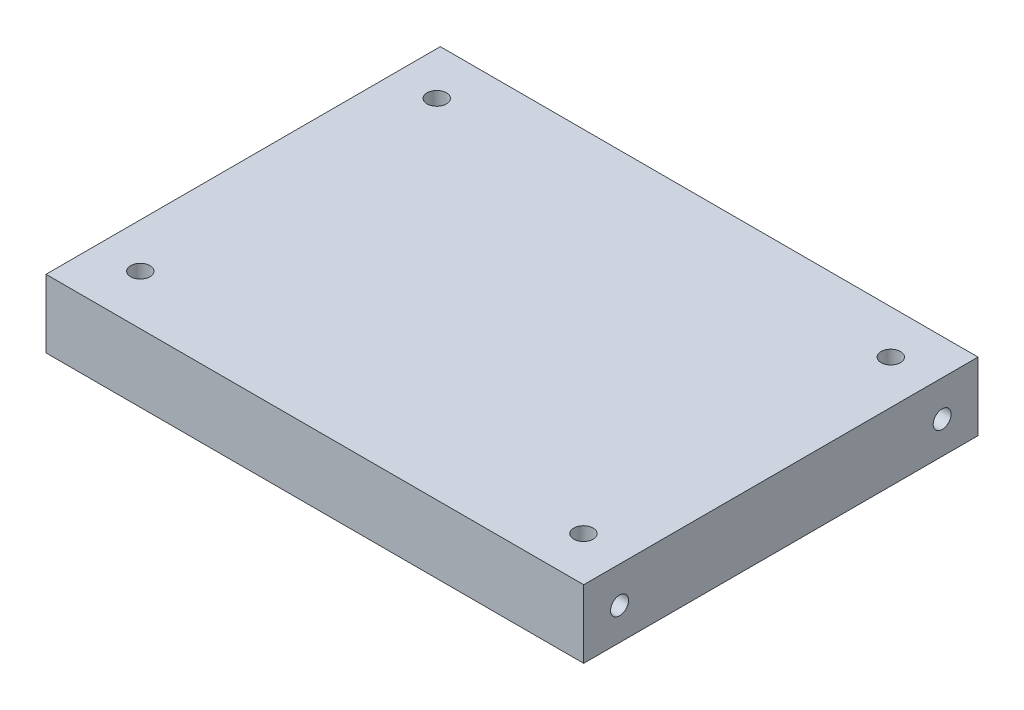
ISO-10303-21;
HEADER;
FILE_DESCRIPTION(('STEP AP214'),'2;1');
FILE_NAME('part.step','',(''),(''),'','','');
FILE_SCHEMA(('AUTOMOTIVE_DESIGN { 1 0 10303 214 1 1 1 1 }'));
ENDSEC;
DATA;
#1=APPLICATION_CONTEXT('core data for automotive mechanical design processes');
#2=APPLICATION_PROTOCOL_DEFINITION('international standard','automotive_design',2000,#1);
#3=PRODUCT_CONTEXT('',#1,'mechanical');
#4=PRODUCT('Part','Part','',(#3));
#5=PRODUCT_RELATED_PRODUCT_CATEGORY('part','',(#4));
#6=PRODUCT_DEFINITION_FORMATION('','',#4);
#7=PRODUCT_DEFINITION_CONTEXT('part definition',#1,'design');
#8=PRODUCT_DEFINITION('design','',#6,#7);
#9=PRODUCT_DEFINITION_SHAPE('','',#8);
#10=(LENGTH_UNIT() NAMED_UNIT(*) SI_UNIT(.MILLI.,.METRE.));
#11=(NAMED_UNIT(*) PLANE_ANGLE_UNIT() SI_UNIT($,.RADIAN.));
#12=(NAMED_UNIT(*) SI_UNIT($,.STERADIAN.) SOLID_ANGLE_UNIT());
#13=UNCERTAINTY_MEASURE_WITH_UNIT(LENGTH_MEASURE(1.E-05),#10,'distance_accuracy_value','');
#14=(GEOMETRIC_REPRESENTATION_CONTEXT(3) GLOBAL_UNCERTAINTY_ASSIGNED_CONTEXT((#13)) GLOBAL_UNIT_ASSIGNED_CONTEXT((#10,
#11,#12)) REPRESENTATION_CONTEXT('',''));
#15=CARTESIAN_POINT('',(0.,0.,0.));
#16=DIRECTION('',(0.,0.,1.));
#17=DIRECTION('',(1.,0.,0.));
#18=AXIS2_PLACEMENT_3D('',#15,#16,#17);
#19=CARTESIAN_POINT('',(-37.5,9.5,-27.5));
#20=DIRECTION('',(1.,0.,0.));
#21=DIRECTION('',(0.,0.,-1.));
#22=AXIS2_PLACEMENT_3D('',#19,#20,#21);
#23=PLANE('',#22);
#24=CARTESIAN_POINT('',(-37.5,4.50000000000001,22.5));
#25=DIRECTION('',(-1.,0.,0.));
#26=DIRECTION('',(0.,0.,1.));
#27=AXIS2_PLACEMENT_3D('',#24,#25,#26);
#28=CIRCLE('',#27,1.24999999999999);
#29=CARTESIAN_POINT('',(-37.5,4.50000000000001,23.75));
#30=VERTEX_POINT('',#29);
#31=EDGE_CURVE('E141',#30,#30,#28,.T.);
#32=ORIENTED_EDGE('',*,*,#31,.F.);
#33=EDGE_LOOP('',(#32));
#34=FACE_BOUND('',#33,.T.);
#35=CARTESIAN_POINT('',(-37.5,4.5,-22.5));
#36=DIRECTION('',(-1.,0.,0.));
#37=DIRECTION('',(0.,0.,1.));
#38=AXIS2_PLACEMENT_3D('',#35,#36,#37);
#39=CIRCLE('',#38,1.24999999999999);
#40=CARTESIAN_POINT('',(-37.5,4.5,-21.25));
#41=VERTEX_POINT('',#40);
#42=EDGE_CURVE('E149',#41,#41,#39,.T.);
#43=ORIENTED_EDGE('',*,*,#42,.F.);
#44=EDGE_LOOP('',(#43));
#45=FACE_BOUND('',#44,.T.);
#46=DIRECTION('',(0.,0.,1.));
#47=VECTOR('',#46,1.);
#48=CARTESIAN_POINT('',(-37.5,0.,-27.5));
#49=LINE('',#48,#47);
#50=CARTESIAN_POINT('',(-37.5,0.,-27.5));
#51=VERTEX_POINT('',#50);
#52=CARTESIAN_POINT('',(-37.5,0.,27.5));
#53=VERTEX_POINT('',#52);
#54=EDGE_CURVE('E185',#51,#53,#49,.T.);
#55=ORIENTED_EDGE('',*,*,#54,.T.);
#56=DIRECTION('',(0.,-1.,0.));
#57=VECTOR('',#56,1.);
#58=CARTESIAN_POINT('',(-37.5,9.5,27.5));
#59=LINE('',#58,#57);
#60=CARTESIAN_POINT('',(-37.5,9.5,27.5));
#61=VERTEX_POINT('',#60);
#62=EDGE_CURVE('E11',#61,#53,#59,.T.);
#63=ORIENTED_EDGE('',*,*,#62,.F.);
#64=DIRECTION('',(0.,0.,1.));
#65=VECTOR('',#64,1.);
#66=CARTESIAN_POINT('',(-37.5,9.5,-27.5));
#67=LINE('',#66,#65);
#68=CARTESIAN_POINT('',(-37.5,9.5,-27.5));
#69=VERTEX_POINT('',#68);
#70=EDGE_CURVE('E174',#69,#61,#67,.T.);
#71=ORIENTED_EDGE('',*,*,#70,.F.);
#72=DIRECTION('',(0.,-1.,0.));
#73=VECTOR('',#72,1.);
#74=CARTESIAN_POINT('',(-37.5,9.5,-27.5));
#75=LINE('',#74,#73);
#76=EDGE_CURVE('E184',#69,#51,#75,.T.);
#77=ORIENTED_EDGE('',*,*,#76,.T.);
#78=EDGE_LOOP('',(#55,#63,#71,#77));
#79=FACE_BOUND('',#78,.T.);
#80=ADVANCED_FACE('F53',(#34,#45,#79),#23,.F.);
#81=CARTESIAN_POINT('',(37.5,9.5,27.5));
#82=DIRECTION('',(0.,0.,-1.));
#83=DIRECTION('',(-1.,0.,0.));
#84=AXIS2_PLACEMENT_3D('',#81,#82,#83);
#85=PLANE('',#84);
#86=DIRECTION('',(1.,0.,0.));
#87=VECTOR('',#86,1.);
#88=CARTESIAN_POINT('',(37.5,0.,27.5));
#89=LINE('',#88,#87);
#90=CARTESIAN_POINT('',(37.5,0.,27.5));
#91=VERTEX_POINT('',#90);
#92=EDGE_CURVE('E189',#53,#91,#89,.T.);
#93=ORIENTED_EDGE('',*,*,#92,.T.);
#94=DIRECTION('',(0.,-1.,0.));
#95=VECTOR('',#94,1.);
#96=CARTESIAN_POINT('',(37.5,9.5,27.5));
#97=LINE('',#96,#95);
#98=CARTESIAN_POINT('',(37.5,9.5,27.5));
#99=VERTEX_POINT('',#98);
#100=EDGE_CURVE('E63',#99,#91,#97,.T.);
#101=ORIENTED_EDGE('',*,*,#100,.F.);
#102=DIRECTION('',(1.,0.,0.));
#103=VECTOR('',#102,1.);
#104=CARTESIAN_POINT('',(37.5,9.5,27.5));
#105=LINE('',#104,#103);
#106=EDGE_CURVE('E103',#61,#99,#105,.T.);
#107=ORIENTED_EDGE('',*,*,#106,.F.);
#108=ORIENTED_EDGE('',*,*,#62,.T.);
#109=EDGE_LOOP('',(#93,#101,#107,#108));
#110=FACE_BOUND('',#109,.T.);
#111=ADVANCED_FACE('F239',(#110),#85,.F.);
#112=CARTESIAN_POINT('',(37.5,9.5,-27.5));
#113=DIRECTION('',(-1.,0.,0.));
#114=DIRECTION('',(0.,0.,1.));
#115=AXIS2_PLACEMENT_3D('',#112,#113,#114);
#116=PLANE('',#115);
#117=CARTESIAN_POINT('',(37.5,4.50000000000001,22.5));
#118=DIRECTION('',(1.,0.,0.));
#119=DIRECTION('',(0.,0.,-1.));
#120=AXIS2_PLACEMENT_3D('',#117,#118,#119);
#121=CIRCLE('',#120,1.24999999999999);
#122=CARTESIAN_POINT('',(37.5,4.50000000000001,21.25));
#123=VERTEX_POINT('',#122);
#124=EDGE_CURVE('E128',#123,#123,#121,.T.);
#125=ORIENTED_EDGE('',*,*,#124,.F.);
#126=EDGE_LOOP('',(#125));
#127=FACE_BOUND('',#126,.T.);
#128=CARTESIAN_POINT('',(37.5,4.5,-22.5));
#129=DIRECTION('',(1.,0.,0.));
#130=DIRECTION('',(0.,0.,-1.));
#131=AXIS2_PLACEMENT_3D('',#128,#129,#130);
#132=CIRCLE('',#131,1.24999999999999);
#133=CARTESIAN_POINT('',(37.5,4.5,-23.75));
#134=VERTEX_POINT('',#133);
#135=EDGE_CURVE('E127',#134,#134,#132,.T.);
#136=ORIENTED_EDGE('',*,*,#135,.F.);
#137=EDGE_LOOP('',(#136));
#138=FACE_BOUND('',#137,.T.);
#139=DIRECTION('',(0.,0.,-1.));
#140=VECTOR('',#139,1.);
#141=CARTESIAN_POINT('',(37.5,0.,-27.5));
#142=LINE('',#141,#140);
#143=CARTESIAN_POINT('',(37.5,0.,-27.5));
#144=VERTEX_POINT('',#143);
#145=EDGE_CURVE('E90',#91,#144,#142,.T.);
#146=ORIENTED_EDGE('',*,*,#145,.T.);
#147=DIRECTION('',(0.,-1.,0.));
#148=VECTOR('',#147,1.);
#149=CARTESIAN_POINT('',(37.5,9.5,-27.5));
#150=LINE('',#149,#148);
#151=CARTESIAN_POINT('',(37.5,9.5,-27.5));
#152=VERTEX_POINT('',#151);
#153=EDGE_CURVE('E198',#152,#144,#150,.T.);
#154=ORIENTED_EDGE('',*,*,#153,.F.);
#155=DIRECTION('',(0.,0.,-1.));
#156=VECTOR('',#155,1.);
#157=CARTESIAN_POINT('',(37.5,9.5,-27.5));
#158=LINE('',#157,#156);
#159=EDGE_CURVE('E179',#99,#152,#158,.T.);
#160=ORIENTED_EDGE('',*,*,#159,.F.);
#161=ORIENTED_EDGE('',*,*,#100,.T.);
#162=EDGE_LOOP('',(#146,#154,#160,#161));
#163=FACE_BOUND('',#162,.T.);
#164=ADVANCED_FACE('F238',(#127,#138,#163),#116,.F.);
#165=CARTESIAN_POINT('',(37.5,9.5,-27.5));
#166=DIRECTION('',(0.,0.,1.));
#167=DIRECTION('',(1.,0.,0.));
#168=AXIS2_PLACEMENT_3D('',#165,#166,#167);
#169=PLANE('',#168);
#170=DIRECTION('',(-1.,0.,0.));
#171=VECTOR('',#170,1.);
#172=CARTESIAN_POINT('',(37.5,0.,-27.5));
#173=LINE('',#172,#171);
#174=EDGE_CURVE('E96',#144,#51,#173,.T.);
#175=ORIENTED_EDGE('',*,*,#174,.T.);
#176=ORIENTED_EDGE('',*,*,#76,.F.);
#177=DIRECTION('',(-1.,0.,0.));
#178=VECTOR('',#177,1.);
#179=CARTESIAN_POINT('',(37.5,9.5,-27.5));
#180=LINE('',#179,#178);
#181=EDGE_CURVE('E72',#152,#69,#180,.T.);
#182=ORIENTED_EDGE('',*,*,#181,.F.);
#183=ORIENTED_EDGE('',*,*,#153,.T.);
#184=EDGE_LOOP('',(#175,#176,#182,#183));
#185=FACE_BOUND('',#184,.T.);
#186=ADVANCED_FACE('F236',(#185),#169,.F.);
#187=CARTESIAN_POINT('',(0.,9.5,0.));
#188=DIRECTION('',(0.,-1.,0.));
#189=DIRECTION('',(0.,0.,-1.));
#190=AXIS2_PLACEMENT_3D('',#187,#188,#189);
#191=PLANE('',#190);
#192=CARTESIAN_POINT('',(-31.2971683023395,9.5,20.5481742450056));
#193=DIRECTION('',(0.,1.,0.));
#194=DIRECTION('',(0.,0.,1.));
#195=AXIS2_PLACEMENT_3D('',#192,#193,#194);
#196=CIRCLE('',#195,1.35);
#197=CARTESIAN_POINT('',(-31.2971683023395,9.5,21.8981742450056));
#198=VERTEX_POINT('',#197);
#199=EDGE_CURVE('E157',#198,#198,#196,.T.);
#200=ORIENTED_EDGE('',*,*,#199,.F.);
#201=EDGE_LOOP('',(#200));
#202=FACE_BOUND('',#201,.T.);
#203=CARTESIAN_POINT('',(31.3065426607212,9.5,21.3464000678498));
#204=DIRECTION('',(0.,1.,0.));
#205=DIRECTION('',(0.,0.,1.));
#206=AXIS2_PLACEMENT_3D('',#203,#204,#205);
#207=CIRCLE('',#206,1.35);
#208=CARTESIAN_POINT('',(31.3065426607212,9.5,22.6964000678498));
#209=VERTEX_POINT('',#208);
#210=EDGE_CURVE('E163',#209,#209,#207,.T.);
#211=ORIENTED_EDGE('',*,*,#210,.F.);
#212=EDGE_LOOP('',(#211));
#213=FACE_BOUND('',#212,.T.);
#214=CARTESIAN_POINT('',(31.4205749211275,9.5,-21.4156975845141));
#215=DIRECTION('',(0.,1.,0.));
#216=DIRECTION('',(0.,0.,1.));
#217=AXIS2_PLACEMENT_3D('',#214,#215,#216);
#218=CIRCLE('',#217,1.35);
#219=CARTESIAN_POINT('',(31.4205749211275,9.5,-20.0656975845141));
#220=VERTEX_POINT('',#219);
#221=EDGE_CURVE('E158',#220,#220,#218,.T.);
#222=ORIENTED_EDGE('',*,*,#221,.F.);
#223=EDGE_LOOP('',(#222));
#224=FACE_BOUND('',#223,.T.);
#225=CARTESIAN_POINT('',(-31.5,9.5,-21.));
#226=DIRECTION('',(0.,1.,0.));
#227=DIRECTION('',(0.,0.,1.));
#228=AXIS2_PLACEMENT_3D('',#225,#226,#227);
#229=CIRCLE('',#228,1.35);
#230=CARTESIAN_POINT('',(-31.5,9.5,-19.65));
#231=VERTEX_POINT('',#230);
#232=EDGE_CURVE('E162',#231,#231,#229,.T.);
#233=ORIENTED_EDGE('',*,*,#232,.F.);
#234=EDGE_LOOP('',(#233));
#235=FACE_BOUND('',#234,.T.);
#236=ORIENTED_EDGE('',*,*,#70,.T.);
#237=ORIENTED_EDGE('',*,*,#106,.T.);
#238=ORIENTED_EDGE('',*,*,#159,.T.);
#239=ORIENTED_EDGE('',*,*,#181,.T.);
#240=EDGE_LOOP('',(#236,#237,#238,#239));
#241=FACE_BOUND('',#240,.T.);
#242=ADVANCED_FACE('F225',(#202,#213,#224,#235,#241),#191,.F.);
#243=CARTESIAN_POINT('',(0.,0.,0.));
#244=DIRECTION('',(0.,-1.,0.));
#245=DIRECTION('',(0.,0.,-1.));
#246=AXIS2_PLACEMENT_3D('',#243,#244,#245);
#247=PLANE('',#246);
#248=CARTESIAN_POINT('',(-31.2971683023395,0.,20.5481742450056));
#249=DIRECTION('',(0.,-1.,0.));
#250=DIRECTION('',(0.,0.,-1.));
#251=AXIS2_PLACEMENT_3D('',#248,#249,#250);
#252=CIRCLE('',#251,1.35);
#253=CARTESIAN_POINT('',(-31.2971683023395,0.,19.1981742450056));
#254=VERTEX_POINT('',#253);
#255=EDGE_CURVE('E56',#254,#254,#252,.T.);
#256=ORIENTED_EDGE('',*,*,#255,.F.);
#257=EDGE_LOOP('',(#256));
#258=FACE_BOUND('',#257,.T.);
#259=CARTESIAN_POINT('',(31.3065426607212,0.,21.3464000678498));
#260=DIRECTION('',(0.,-1.,0.));
#261=DIRECTION('',(0.,0.,-1.));
#262=AXIS2_PLACEMENT_3D('',#259,#260,#261);
#263=CIRCLE('',#262,1.35);
#264=CARTESIAN_POINT('',(31.3065426607212,0.,19.9964000678498));
#265=VERTEX_POINT('',#264);
#266=EDGE_CURVE('E209',#265,#265,#263,.T.);
#267=ORIENTED_EDGE('',*,*,#266,.F.);
#268=EDGE_LOOP('',(#267));
#269=FACE_BOUND('',#268,.T.);
#270=CARTESIAN_POINT('',(31.4205749211275,0.,-21.4156975845141));
#271=DIRECTION('',(0.,-1.,0.));
#272=DIRECTION('',(0.,0.,-1.));
#273=AXIS2_PLACEMENT_3D('',#270,#271,#272);
#274=CIRCLE('',#273,1.35);
#275=CARTESIAN_POINT('',(31.4205749211275,0.,-22.7656975845141));
#276=VERTEX_POINT('',#275);
#277=EDGE_CURVE('E206',#276,#276,#274,.T.);
#278=ORIENTED_EDGE('',*,*,#277,.F.);
#279=EDGE_LOOP('',(#278));
#280=FACE_BOUND('',#279,.T.);
#281=CARTESIAN_POINT('',(-31.5,0.,-21.));
#282=DIRECTION('',(0.,-1.,0.));
#283=DIRECTION('',(0.,0.,-1.));
#284=AXIS2_PLACEMENT_3D('',#281,#282,#283);
#285=CIRCLE('',#284,1.35);
#286=CARTESIAN_POINT('',(-31.5,0.,-22.35));
#287=VERTEX_POINT('',#286);
#288=EDGE_CURVE('E173',#287,#287,#285,.T.);
#289=ORIENTED_EDGE('',*,*,#288,.F.);
#290=EDGE_LOOP('',(#289));
#291=FACE_BOUND('',#290,.T.);
#292=ORIENTED_EDGE('',*,*,#54,.F.);
#293=ORIENTED_EDGE('',*,*,#174,.F.);
#294=ORIENTED_EDGE('',*,*,#145,.F.);
#295=ORIENTED_EDGE('',*,*,#92,.F.);
#296=EDGE_LOOP('',(#292,#293,#294,#295));
#297=FACE_BOUND('',#296,.T.);
#298=ADVANCED_FACE('F221',(#258,#269,#280,#291,#297),#247,.T.);
#299=CARTESIAN_POINT('',(-31.5,-0.5,-21.));
#300=DIRECTION('',(0.,1.,0.));
#301=DIRECTION('',(0.,0.,1.));
#302=AXIS2_PLACEMENT_3D('',#299,#300,#301);
#303=CYLINDRICAL_SURFACE('',#302,1.35);
#304=ORIENTED_EDGE('',*,*,#288,.T.);
#305=EDGE_LOOP('',(#304));
#306=FACE_BOUND('',#305,.T.);
#307=ORIENTED_EDGE('',*,*,#232,.T.);
#308=EDGE_LOOP('',(#307));
#309=FACE_BOUND('',#308,.T.);
#310=ADVANCED_FACE('F224',(#306,#309),#303,.F.);
#311=CARTESIAN_POINT('',(31.4205749211275,-0.5,-21.4156975845141));
#312=DIRECTION('',(0.,1.,0.));
#313=DIRECTION('',(0.,0.,1.));
#314=AXIS2_PLACEMENT_3D('',#311,#312,#313);
#315=CYLINDRICAL_SURFACE('',#314,1.35);
#316=ORIENTED_EDGE('',*,*,#277,.T.);
#317=EDGE_LOOP('',(#316));
#318=FACE_BOUND('',#317,.T.);
#319=ORIENTED_EDGE('',*,*,#221,.T.);
#320=EDGE_LOOP('',(#319));
#321=FACE_BOUND('',#320,.T.);
#322=ADVANCED_FACE('F256',(#318,#321),#315,.F.);
#323=CARTESIAN_POINT('',(31.3065426607212,-0.5,21.3464000678498));
#324=DIRECTION('',(0.,1.,0.));
#325=DIRECTION('',(0.,0.,1.));
#326=AXIS2_PLACEMENT_3D('',#323,#324,#325);
#327=CYLINDRICAL_SURFACE('',#326,1.35);
#328=ORIENTED_EDGE('',*,*,#266,.T.);
#329=EDGE_LOOP('',(#328));
#330=FACE_BOUND('',#329,.T.);
#331=ORIENTED_EDGE('',*,*,#210,.T.);
#332=EDGE_LOOP('',(#331));
#333=FACE_BOUND('',#332,.T.);
#334=ADVANCED_FACE('F261',(#330,#333),#327,.F.);
#335=CARTESIAN_POINT('',(-31.2971683023395,-0.5,20.5481742450056));
#336=DIRECTION('',(0.,1.,0.));
#337=DIRECTION('',(0.,0.,1.));
#338=AXIS2_PLACEMENT_3D('',#335,#336,#337);
#339=CYLINDRICAL_SURFACE('',#338,1.35);
#340=ORIENTED_EDGE('',*,*,#255,.T.);
#341=EDGE_LOOP('',(#340));
#342=FACE_BOUND('',#341,.T.);
#343=ORIENTED_EDGE('',*,*,#199,.T.);
#344=EDGE_LOOP('',(#343));
#345=FACE_BOUND('',#344,.T.);
#346=ADVANCED_FACE('F218',(#342,#345),#339,.F.);
#347=CARTESIAN_POINT('',(-34.5,4.5,-22.5));
#348=DIRECTION('',(-1.,0.,0.));
#349=DIRECTION('',(0.,0.,1.));
#350=AXIS2_PLACEMENT_3D('',#347,#348,#349);
#351=CONICAL_SURFACE('',#350,1.25,1.02974425867665);
#352=CARTESIAN_POINT('',(-33.7489242262155,4.5,-22.5));
#353=VERTEX_POINT('',#352);
#354=VERTEX_LOOP('',#353);
#355=FACE_BOUND('',#354,.T.);
#356=CARTESIAN_POINT('',(-34.5,4.5,-22.5));
#357=DIRECTION('',(-1.,0.,0.));
#358=DIRECTION('',(0.,0.,1.));
#359=AXIS2_PLACEMENT_3D('',#356,#357,#358);
#360=CIRCLE('',#359,1.25);
#361=CARTESIAN_POINT('',(-34.5,4.5,-21.25));
#362=VERTEX_POINT('',#361);
#363=EDGE_CURVE('E153',#362,#362,#360,.T.);
#364=ORIENTED_EDGE('',*,*,#363,.T.);
#365=EDGE_LOOP('',(#364));
#366=FACE_BOUND('',#365,.T.);
#367=ADVANCED_FACE('F260',(#355,#366),#351,.F.);
#368=CARTESIAN_POINT('',(-37.5,4.5,-22.5));
#369=DIRECTION('',(-1.,0.,0.));
#370=DIRECTION('',(0.,0.,1.));
#371=AXIS2_PLACEMENT_3D('',#368,#369,#370);
#372=CYLINDRICAL_SURFACE('',#371,1.24999999999999);
#373=ORIENTED_EDGE('',*,*,#363,.F.);
#374=EDGE_LOOP('',(#373));
#375=FACE_BOUND('',#374,.T.);
#376=ORIENTED_EDGE('',*,*,#42,.T.);
#377=EDGE_LOOP('',(#376));
#378=FACE_BOUND('',#377,.T.);
#379=ADVANCED_FACE('F269',(#375,#378),#372,.F.);
#380=CARTESIAN_POINT('',(-34.5,4.50000000000001,22.5));
#381=DIRECTION('',(-1.,0.,0.));
#382=DIRECTION('',(0.,0.,1.));
#383=AXIS2_PLACEMENT_3D('',#380,#381,#382);
#384=CONICAL_SURFACE('',#383,1.25,1.02974425867665);
#385=CARTESIAN_POINT('',(-33.7489242262155,4.50000000000001,22.5));
#386=VERTEX_POINT('',#385);
#387=VERTEX_LOOP('',#386);
#388=FACE_BOUND('',#387,.T.);
#389=CARTESIAN_POINT('',(-34.5,4.50000000000001,22.5));
#390=DIRECTION('',(-1.,0.,0.));
#391=DIRECTION('',(0.,0.,1.));
#392=AXIS2_PLACEMENT_3D('',#389,#390,#391);
#393=CIRCLE('',#392,1.25);
#394=CARTESIAN_POINT('',(-34.5,4.50000000000001,23.75));
#395=VERTEX_POINT('',#394);
#396=EDGE_CURVE('E145',#395,#395,#393,.T.);
#397=ORIENTED_EDGE('',*,*,#396,.T.);
#398=EDGE_LOOP('',(#397));
#399=FACE_BOUND('',#398,.T.);
#400=ADVANCED_FACE('F273',(#388,#399),#384,.F.);
#401=CARTESIAN_POINT('',(-37.5,4.50000000000001,22.5));
#402=DIRECTION('',(-1.,0.,0.));
#403=DIRECTION('',(0.,0.,1.));
#404=AXIS2_PLACEMENT_3D('',#401,#402,#403);
#405=CYLINDRICAL_SURFACE('',#404,1.24999999999999);
#406=ORIENTED_EDGE('',*,*,#396,.F.);
#407=EDGE_LOOP('',(#406));
#408=FACE_BOUND('',#407,.T.);
#409=ORIENTED_EDGE('',*,*,#31,.T.);
#410=EDGE_LOOP('',(#409));
#411=FACE_BOUND('',#410,.T.);
#412=ADVANCED_FACE('F277',(#408,#411),#405,.F.);
#413=CARTESIAN_POINT('',(34.5,4.5,-22.5));
#414=DIRECTION('',(1.,0.,0.));
#415=DIRECTION('',(0.,0.,-1.));
#416=AXIS2_PLACEMENT_3D('',#413,#414,#415);
#417=CONICAL_SURFACE('',#416,1.25,1.02974425867665);
#418=CARTESIAN_POINT('',(33.7489242262155,4.5,-22.5));
#419=VERTEX_POINT('',#418);
#420=VERTEX_LOOP('',#419);
#421=FACE_BOUND('',#420,.T.);
#422=CARTESIAN_POINT('',(34.5,4.5,-22.5));
#423=DIRECTION('',(1.,0.,0.));
#424=DIRECTION('',(0.,0.,-1.));
#425=AXIS2_PLACEMENT_3D('',#422,#423,#424);
#426=CIRCLE('',#425,1.25);
#427=CARTESIAN_POINT('',(34.5,4.5,-23.75));
#428=VERTEX_POINT('',#427);
#429=EDGE_CURVE('E133',#428,#428,#426,.T.);
#430=ORIENTED_EDGE('',*,*,#429,.T.);
#431=EDGE_LOOP('',(#430));
#432=FACE_BOUND('',#431,.T.);
#433=ADVANCED_FACE('F281',(#421,#432),#417,.F.);
#434=CARTESIAN_POINT('',(37.5,4.5,-22.5));
#435=DIRECTION('',(1.,0.,0.));
#436=DIRECTION('',(0.,0.,-1.));
#437=AXIS2_PLACEMENT_3D('',#434,#435,#436);
#438=CYLINDRICAL_SURFACE('',#437,1.24999999999999);
#439=ORIENTED_EDGE('',*,*,#429,.F.);
#440=EDGE_LOOP('',(#439));
#441=FACE_BOUND('',#440,.T.);
#442=ORIENTED_EDGE('',*,*,#135,.T.);
#443=EDGE_LOOP('',(#442));
#444=FACE_BOUND('',#443,.T.);
#445=ADVANCED_FACE('F120',(#441,#444),#438,.F.);
#446=CARTESIAN_POINT('',(34.5,4.50000000000001,22.5));
#447=DIRECTION('',(1.,0.,0.));
#448=DIRECTION('',(0.,0.,-1.));
#449=AXIS2_PLACEMENT_3D('',#446,#447,#448);
#450=CONICAL_SURFACE('',#449,1.25,1.02974425867665);
#451=CARTESIAN_POINT('',(33.7489242262155,4.50000000000001,22.5));
#452=VERTEX_POINT('',#451);
#453=VERTEX_LOOP('',#452);
#454=FACE_BOUND('',#453,.T.);
#455=CARTESIAN_POINT('',(34.5,4.50000000000001,22.5));
#456=DIRECTION('',(1.,0.,0.));
#457=DIRECTION('',(0.,0.,-1.));
#458=AXIS2_PLACEMENT_3D('',#455,#456,#457);
#459=CIRCLE('',#458,1.25);
#460=CARTESIAN_POINT('',(34.5,4.50000000000001,21.25));
#461=VERTEX_POINT('',#460);
#462=EDGE_CURVE('E124',#461,#461,#459,.T.);
#463=ORIENTED_EDGE('',*,*,#462,.T.);
#464=EDGE_LOOP('',(#463));
#465=FACE_BOUND('',#464,.T.);
#466=ADVANCED_FACE('F116',(#454,#465),#450,.F.);
#467=CARTESIAN_POINT('',(37.5,4.50000000000001,22.5));
#468=DIRECTION('',(1.,0.,0.));
#469=DIRECTION('',(0.,0.,-1.));
#470=AXIS2_PLACEMENT_3D('',#467,#468,#469);
#471=CYLINDRICAL_SURFACE('',#470,1.24999999999999);
#472=ORIENTED_EDGE('',*,*,#462,.F.);
#473=EDGE_LOOP('',(#472));
#474=FACE_BOUND('',#473,.T.);
#475=ORIENTED_EDGE('',*,*,#124,.T.);
#476=EDGE_LOOP('',(#475));
#477=FACE_BOUND('',#476,.T.);
#478=ADVANCED_FACE('F119',(#474,#477),#471,.F.);
#479=CLOSED_SHELL('',(#80,#111,#164,#186,#242,#298,#310,#322,#334,#346,#367,#379,#400,#412,#433,
#445,#466,#478));
#480=MANIFOLD_SOLID_BREP('B2',#479);
#481=ADVANCED_BREP_SHAPE_REPRESENTATION('',(#18,#480),#14);
#482=SHAPE_DEFINITION_REPRESENTATION(#9,#481);
ENDSEC;
END-ISO-10303-21;
